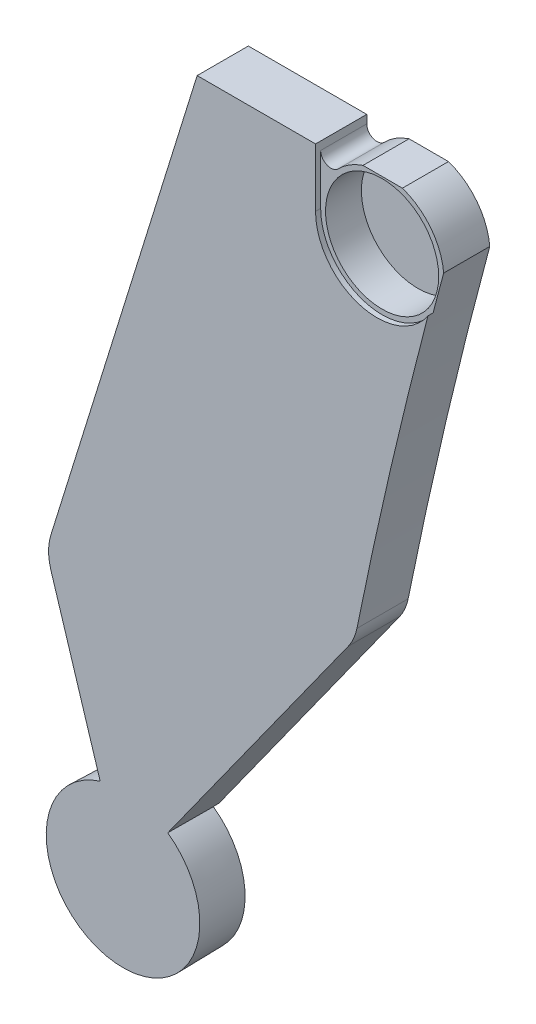
ISO-10303-21;
HEADER;
FILE_DESCRIPTION(('STEP AP214'),'2;1');
FILE_NAME('part.step','',(''),(''),'','','');
FILE_SCHEMA(('AUTOMOTIVE_DESIGN { 1 0 10303 214 1 1 1 1 }'));
ENDSEC;
DATA;
#1=APPLICATION_CONTEXT('core data for automotive mechanical design processes');
#2=APPLICATION_PROTOCOL_DEFINITION('international standard','automotive_design',2000,#1);
#3=PRODUCT_CONTEXT('',#1,'mechanical');
#4=PRODUCT('Part','Part','',(#3));
#5=PRODUCT_RELATED_PRODUCT_CATEGORY('part','',(#4));
#6=PRODUCT_DEFINITION_FORMATION('','',#4);
#7=PRODUCT_DEFINITION_CONTEXT('part definition',#1,'design');
#8=PRODUCT_DEFINITION('design','',#6,#7);
#9=PRODUCT_DEFINITION_SHAPE('','',#8);
#10=(LENGTH_UNIT() NAMED_UNIT(*) SI_UNIT(.MILLI.,.METRE.));
#11=(NAMED_UNIT(*) PLANE_ANGLE_UNIT() SI_UNIT($,.RADIAN.));
#12=(NAMED_UNIT(*) SI_UNIT($,.STERADIAN.) SOLID_ANGLE_UNIT());
#13=UNCERTAINTY_MEASURE_WITH_UNIT(LENGTH_MEASURE(1.E-05),#10,'distance_accuracy_value','');
#14=(GEOMETRIC_REPRESENTATION_CONTEXT(3) GLOBAL_UNCERTAINTY_ASSIGNED_CONTEXT((#13)) GLOBAL_UNIT_ASSIGNED_CONTEXT((#10,
#11,#12)) REPRESENTATION_CONTEXT('',''));
#15=CARTESIAN_POINT('',(0.,0.,0.));
#16=DIRECTION('',(0.,0.,1.));
#17=DIRECTION('',(1.,0.,0.));
#18=AXIS2_PLACEMENT_3D('',#15,#16,#17);
#19=CARTESIAN_POINT('',(110.,290.,10.));
#20=DIRECTION('',(0.,-1.,0.));
#21=DIRECTION('',(0.,0.,-1.));
#22=AXIS2_PLACEMENT_3D('',#19,#20,#21);
#23=PLANE('',#22);
#24=DIRECTION('',(-1.,0.,0.));
#25=VECTOR('',#24,1.);
#26=CARTESIAN_POINT('',(110.,290.,0.));
#27=LINE('',#26,#25);
#28=CARTESIAN_POINT('',(83.1244102791782,290.,0.));
#29=VERTEX_POINT('',#28);
#30=CARTESIAN_POINT('',(60.,290.,0.));
#31=VERTEX_POINT('',#30);
#32=EDGE_CURVE('E158',#29,#31,#27,.T.);
#33=ORIENTED_EDGE('',*,*,#32,.T.);
#34=DIRECTION('',(0.,0.,1.));
#35=VECTOR('',#34,1.);
#36=CARTESIAN_POINT('',(60.,290.,0.));
#37=LINE('',#36,#35);
#38=CARTESIAN_POINT('',(60.,290.,10.));
#39=VERTEX_POINT('',#38);
#40=EDGE_CURVE('E163',#31,#39,#37,.T.);
#41=ORIENTED_EDGE('',*,*,#40,.T.);
#42=DIRECTION('',(-1.,0.,0.));
#43=VECTOR('',#42,1.);
#44=CARTESIAN_POINT('',(110.,290.,10.));
#45=LINE('',#44,#43);
#46=CARTESIAN_POINT('',(83.1244102791782,290.,10.));
#47=VERTEX_POINT('',#46);
#48=EDGE_CURVE('E189',#47,#39,#45,.T.);
#49=ORIENTED_EDGE('',*,*,#48,.F.);
#50=DIRECTION('',(0.,0.,-1.));
#51=VECTOR('',#50,1.);
#52=CARTESIAN_POINT('',(83.1244102791781,290.,10.));
#53=LINE('',#52,#51);
#54=EDGE_CURVE('E174',#47,#29,#53,.T.);
#55=ORIENTED_EDGE('',*,*,#54,.T.);
#56=EDGE_LOOP('',(#33,#41,#49,#55));
#57=FACE_BOUND('',#56,.T.);
#58=ADVANCED_FACE('F36',(#57),#23,.F.);
#59=CARTESIAN_POINT('',(866.,0.,0.));
#60=DIRECTION('',(0.,0.,-1.));
#61=DIRECTION('',(-1.,0.,0.));
#62=AXIS2_PLACEMENT_3D('',#59,#60,#61);
#63=PLANE('',#62);
#64=DIRECTION('',(0.297483501632837,-0.954726959007792,0.));
#65=VECTOR('',#64,1.);
#66=CARTESIAN_POINT('',(25.8476328665139,210.,0.));
#67=LINE('',#66,#65);
#68=CARTESIAN_POINT('',(31.4334430823078,192.073212223037,0.));
#69=VERTEX_POINT('',#68);
#70=CARTESIAN_POINT('',(41.0595930049664,161.179583527098,0.));
#71=VERTEX_POINT('',#70);
#72=EDGE_CURVE('E298',#69,#71,#67,.T.);
#73=ORIENTED_EDGE('',*,*,#72,.F.);
#74=CARTESIAN_POINT('',(40.9807126723857,195.048047239366,0.));
#75=DIRECTION('',(0.,0.,-1.));
#76=DIRECTION('',(-1.,0.,0.));
#77=AXIS2_PLACEMENT_3D('',#74,#75,#76);
#78=CIRCLE('',#77,10.);
#79=CARTESIAN_POINT('',(31.4307163547867,198.014117085786,0.));
#80=VERTEX_POINT('',#79);
#81=EDGE_CURVE('E11',#69,#80,#78,.T.);
#82=ORIENTED_EDGE('',*,*,#81,.T.);
#83=DIRECTION('',(0.296606984642063,0.954999631759899,0.));
#84=VECTOR('',#83,1.);
#85=CARTESIAN_POINT('',(60.,290.,0.));
#86=LINE('',#85,#84);
#87=EDGE_CURVE('E153',#80,#31,#86,.T.);
#88=ORIENTED_EDGE('',*,*,#87,.T.);
#89=ORIENTED_EDGE('',*,*,#32,.F.);
#90=DIRECTION('',(0.,1.,0.));
#91=VECTOR('',#90,1.);
#92=CARTESIAN_POINT('',(83.1244102791782,0.,0.));
#93=LINE('',#92,#91);
#94=CARTESIAN_POINT('',(83.1244102791782,288.394928503876,0.));
#95=VERTEX_POINT('',#94);
#96=EDGE_CURVE('E243',#95,#29,#93,.T.);
#97=ORIENTED_EDGE('',*,*,#96,.F.);
#98=CARTESIAN_POINT('',(85.1244102791781,288.394928503876,0.));
#99=DIRECTION('',(0.,0.,-1.));
#100=DIRECTION('',(-1.,0.,0.));
#101=AXIS2_PLACEMENT_3D('',#98,#99,#100);
#102=CIRCLE('',#101,2.);
#103=CARTESIAN_POINT('',(86.5529817077496,286.995220079428,0.));
#104=VERTEX_POINT('',#103);
#105=EDGE_CURVE('E223',#95,#104,#102,.F.);
#106=ORIENTED_EDGE('',*,*,#105,.T.);
#107=CARTESIAN_POINT('',(95.1244102791782,278.596969532743,0.));
#108=DIRECTION('',(0.,0.,-1.));
#109=DIRECTION('',(-1.,0.,0.));
#110=AXIS2_PLACEMENT_3D('',#107,#108,#109);
#111=CIRCLE('',#110,12.);
#112=CARTESIAN_POINT('',(91.3866440795868,290.,0.));
#113=VERTEX_POINT('',#112);
#114=EDGE_CURVE('E245',#113,#104,#111,.F.);
#115=ORIENTED_EDGE('',*,*,#114,.F.);
#116=CARTESIAN_POINT('',(99.0889064313522,290.,0.));
#117=VERTEX_POINT('',#116);
#118=EDGE_CURVE('E175',#117,#113,#27,.T.);
#119=ORIENTED_EDGE('',*,*,#118,.F.);
#120=CARTESIAN_POINT('',(95.1244102791782,278.596969532743,0.));
#121=DIRECTION('',(0.,0.,-1.));
#122=DIRECTION('',(-1.,0.,0.));
#123=AXIS2_PLACEMENT_3D('',#120,#121,#122);
#124=CIRCLE('',#123,12.072544619002);
#125=CARTESIAN_POINT('',(107.149564915538,279.665608643834,0.));
#126=VERTEX_POINT('',#125);
#127=EDGE_CURVE('E235',#126,#117,#124,.F.);
#128=ORIENTED_EDGE('',*,*,#127,.F.);
#129=CARTESIAN_POINT('',(1141.25,0.,0.));
#130=DIRECTION('',(0.,0.,-1.));
#131=DIRECTION('',(-1.,0.,0.));
#132=AXIS2_PLACEMENT_3D('',#129,#130,#131);
#133=CIRCLE('',#132,1071.25);
#134=CARTESIAN_POINT('',(91.2067735622464,212.098526897742,0.));
#135=VERTEX_POINT('',#134);
#136=EDGE_CURVE('E176',#135,#126,#133,.T.);
#137=ORIENTED_EDGE('',*,*,#136,.F.);
#138=CARTESIAN_POINT('',(81.4047364426407,214.078443134827,0.));
#139=DIRECTION('',(0.,0.,-1.));
#140=DIRECTION('',(-1.,0.,0.));
#141=AXIS2_PLACEMENT_3D('',#138,#139,#140);
#142=CIRCLE('',#141,10.);
#143=CARTESIAN_POINT('',(89.5321794942386,208.252237727958,0.));
#144=VERTEX_POINT('',#143);
#145=EDGE_CURVE('E188',#135,#144,#142,.T.);
#146=ORIENTED_EDGE('',*,*,#145,.T.);
#147=DIRECTION('',(0.582620540686913,0.812744305159802,0.));
#148=VECTOR('',#147,1.);
#149=CARTESIAN_POINT('',(45.521845529459,146.858679141981,0.));
#150=LINE('',#149,#148);
#151=CARTESIAN_POINT('',(54.2611536397626,159.049843719378,0.));
#152=VERTEX_POINT('',#151);
#153=EDGE_CURVE('E181',#152,#144,#150,.T.);
#154=ORIENTED_EDGE('',*,*,#153,.F.);
#155=CARTESIAN_POINT('',(45.521845529459,146.858679141981,0.));
#156=DIRECTION('',(0.,0.,-1.));
#157=DIRECTION('',(-1.,0.,0.));
#158=AXIS2_PLACEMENT_3D('',#155,#156,#157);
#159=CIRCLE('',#158,15.);
#160=EDGE_CURVE('E276',#152,#71,#159,.F.);
#161=ORIENTED_EDGE('',*,*,#160,.T.);
#162=EDGE_LOOP('',(#73,#82,#88,#89,#97,#106,#115,#119,#128,#137,#146,#154,#161));
#163=FACE_BOUND('',#162,.T.);
#164=ADVANCED_FACE('F155',(#163),#63,.T.);
#165=CARTESIAN_POINT('',(95.1244102791782,278.596969532743,9.));
#166=DIRECTION('',(0.,0.,1.));
#167=DIRECTION('',(1.,0.,0.));
#168=AXIS2_PLACEMENT_3D('',#165,#166,#167);
#169=PLANE('',#168);
#170=CARTESIAN_POINT('',(95.1244102791782,278.596969532743,9.));
#171=DIRECTION('',(0.,0.,1.));
#172=DIRECTION('',(1.,0.,0.));
#173=AXIS2_PLACEMENT_3D('',#170,#171,#172);
#174=CIRCLE('',#173,11.05);
#175=CARTESIAN_POINT('',(106.174410279178,278.596969532743,9.));
#176=VERTEX_POINT('',#175);
#177=EDGE_CURVE('E248',#176,#176,#174,.T.);
#178=ORIENTED_EDGE('',*,*,#177,.F.);
#179=EDGE_LOOP('',(#178));
#180=FACE_BOUND('',#179,.T.);
#181=CARTESIAN_POINT('',(95.1244102791782,278.596969532743,9.));
#182=DIRECTION('',(0.,0.,-1.));
#183=DIRECTION('',(-1.,0.,0.));
#184=AXIS2_PLACEMENT_3D('',#181,#182,#183);
#185=CIRCLE('',#184,12.);
#186=CARTESIAN_POINT('',(86.5529817077496,286.995220079428,9.));
#187=VERTEX_POINT('',#186);
#188=CARTESIAN_POINT('',(91.3866440795868,290.,9.));
#189=VERTEX_POINT('',#188);
#190=EDGE_CURVE('E171',#187,#189,#185,.T.);
#191=ORIENTED_EDGE('',*,*,#190,.F.);
#192=CARTESIAN_POINT('',(85.1244102791781,288.394928503876,9.));
#193=DIRECTION('',(0.,0.,1.));
#194=DIRECTION('',(1.,0.,0.));
#195=AXIS2_PLACEMENT_3D('',#192,#193,#194);
#196=CIRCLE('',#195,2.);
#197=CARTESIAN_POINT('',(83.1244102791781,288.394928503876,9.));
#198=VERTEX_POINT('',#197);
#199=EDGE_CURVE('E221',#187,#198,#196,.F.);
#200=ORIENTED_EDGE('',*,*,#199,.T.);
#201=DIRECTION('',(0.,1.,0.));
#202=VECTOR('',#201,1.);
#203=CARTESIAN_POINT('',(83.1244102791781,278.596969532743,9.));
#204=LINE('',#203,#202);
#205=CARTESIAN_POINT('',(83.1244102791781,278.596969532743,9.));
#206=VERTEX_POINT('',#205);
#207=EDGE_CURVE('E218',#206,#198,#204,.T.);
#208=ORIENTED_EDGE('',*,*,#207,.F.);
#209=CARTESIAN_POINT('',(95.1244102791782,278.596969532743,9.));
#210=DIRECTION('',(0.,0.,1.));
#211=DIRECTION('',(1.,0.,0.));
#212=AXIS2_PLACEMENT_3D('',#209,#210,#211);
#213=CIRCLE('',#212,12.);
#214=CARTESIAN_POINT('',(105.079858658712,271.89704061055,9.));
#215=VERTEX_POINT('',#214);
#216=EDGE_CURVE('E255',#206,#215,#213,.T.);
#217=ORIENTED_EDGE('',*,*,#216,.T.);
#218=CARTESIAN_POINT('',(1141.25,0.,9.));
#219=DIRECTION('',(0.,0.,1.));
#220=DIRECTION('',(1.,0.,0.));
#221=AXIS2_PLACEMENT_3D('',#218,#219,#220);
#222=CIRCLE('',#221,1071.25);
#223=CARTESIAN_POINT('',(107.149564915525,279.665608643833,9.));
#224=VERTEX_POINT('',#223);
#225=EDGE_CURVE('E266',#215,#224,#222,.F.);
#226=ORIENTED_EDGE('',*,*,#225,.T.);
#227=CARTESIAN_POINT('',(95.1244102791782,278.596969532743,9.));
#228=DIRECTION('',(0.,0.,1.));
#229=DIRECTION('',(1.,0.,0.));
#230=AXIS2_PLACEMENT_3D('',#227,#228,#229);
#231=CIRCLE('',#230,12.072544619002);
#232=CARTESIAN_POINT('',(99.0889064313522,290.,9.));
#233=VERTEX_POINT('',#232);
#234=EDGE_CURVE('E211',#233,#224,#231,.F.);
#235=ORIENTED_EDGE('',*,*,#234,.F.);
#236=DIRECTION('',(-1.,0.,0.));
#237=VECTOR('',#236,1.);
#238=CARTESIAN_POINT('',(110.,290.,9.));
#239=LINE('',#238,#237);
#240=EDGE_CURVE('E208',#233,#189,#239,.T.);
#241=ORIENTED_EDGE('',*,*,#240,.T.);
#242=EDGE_LOOP('',(#191,#200,#208,#217,#226,#235,#241));
#243=FACE_BOUND('',#242,.T.);
#244=ADVANCED_FACE('F321',(#180,#243),#169,.T.);
#245=CARTESIAN_POINT('',(25.8476328665139,210.,-90.5742654006177));
#246=DIRECTION('',(-0.954726959007792,-0.297483501632837,0.));
#247=DIRECTION('',(0.297483501632837,-0.954726959007792,0.));
#248=AXIS2_PLACEMENT_3D('',#245,#246,#247);
#249=PLANE('',#248);
#250=DIRECTION('',(0.297483501632837,-0.954726959007792,0.));
#251=VECTOR('',#250,1.);
#252=CARTESIAN_POINT('',(25.8476328665139,210.,10.));
#253=LINE('',#252,#251);
#254=CARTESIAN_POINT('',(31.4334430823078,192.073212223037,10.));
#255=VERTEX_POINT('',#254);
#256=CARTESIAN_POINT('',(41.0595930049664,161.179583527098,10.));
#257=VERTEX_POINT('',#256);
#258=EDGE_CURVE('E294',#255,#257,#253,.T.);
#259=ORIENTED_EDGE('',*,*,#258,.F.);
#260=DIRECTION('',(0.,0.,1.));
#261=VECTOR('',#260,1.);
#262=CARTESIAN_POINT('',(31.4334430823078,192.073212223037,0.));
#263=LINE('',#262,#261);
#264=EDGE_CURVE('E44',#255,#69,#263,.F.);
#265=ORIENTED_EDGE('',*,*,#264,.T.);
#266=ORIENTED_EDGE('',*,*,#72,.T.);
#267=DIRECTION('',(0.,0.,1.));
#268=VECTOR('',#267,1.);
#269=CARTESIAN_POINT('',(41.0595930049664,161.179583527098,-0.999999999999999));
#270=LINE('',#269,#268);
#271=CARTESIAN_POINT('',(41.0595930049664,161.179583527098,1.));
#272=VERTEX_POINT('',#271);
#273=EDGE_CURVE('E280',#71,#272,#270,.T.);
#274=ORIENTED_EDGE('',*,*,#273,.T.);
#275=DIRECTION('',(0.297483501632837,-0.954726959007792,0.));
#276=VECTOR('',#275,1.);
#277=CARTESIAN_POINT('',(25.8476328665139,210.,1.));
#278=LINE('',#277,#276);
#279=CARTESIAN_POINT('',(41.1063263494911,161.029600137574,1.));
#280=VERTEX_POINT('',#279);
#281=EDGE_CURVE('E272',#272,#280,#278,.T.);
#282=ORIENTED_EDGE('',*,*,#281,.T.);
#283=DIRECTION('',(0.00519180297888258,-0.0166622829252357,-0.999847695156391));
#284=VECTOR('',#283,1.);
#285=CARTESIAN_POINT('',(45.521845529459,146.858679141981,-849.34942446139));
#286=LINE('',#285,#284);
#287=EDGE_CURVE('E291',#257,#280,#286,.T.);
#288=ORIENTED_EDGE('',*,*,#287,.F.);
#289=EDGE_LOOP('',(#259,#265,#266,#274,#282,#288));
#290=FACE_BOUND('',#289,.T.);
#291=ADVANCED_FACE('F393',(#290),#249,.T.);
#292=CARTESIAN_POINT('',(45.521845529459,146.858679141981,-90.5742654006177));
#293=DIRECTION('',(0.812744305159802,-0.582620540686913,0.));
#294=DIRECTION('',(0.582620540686913,0.812744305159802,0.));
#295=AXIS2_PLACEMENT_3D('',#292,#293,#294);
#296=PLANE('',#295);
#297=DIRECTION('',(0.582620540686913,0.812744305159802,0.));
#298=VECTOR('',#297,1.);
#299=CARTESIAN_POINT('',(45.521845529459,146.858679141981,1.));
#300=LINE('',#299,#298);
#301=CARTESIAN_POINT('',(54.1696265254668,158.922165177828,1.));
#302=VERTEX_POINT('',#301);
#303=CARTESIAN_POINT('',(54.2611536397626,159.049843719378,1.));
#304=VERTEX_POINT('',#303);
#305=EDGE_CURVE('E273',#302,#304,#300,.T.);
#306=ORIENTED_EDGE('',*,*,#305,.T.);
#307=DIRECTION('',(0.,0.,1.));
#308=VECTOR('',#307,1.);
#309=CARTESIAN_POINT('',(54.2611536397626,159.049843719378,-0.999999999999999));
#310=LINE('',#309,#308);
#311=EDGE_CURVE('E202',#304,#152,#310,.F.);
#312=ORIENTED_EDGE('',*,*,#311,.T.);
#313=ORIENTED_EDGE('',*,*,#153,.T.);
#314=DIRECTION('',(0.,0.,1.));
#315=VECTOR('',#314,1.);
#316=CARTESIAN_POINT('',(89.5321794942386,208.252237727958,10.));
#317=LINE('',#316,#315);
#318=CARTESIAN_POINT('',(89.5321794942386,208.252237727958,10.));
#319=VERTEX_POINT('',#318);
#320=EDGE_CURVE('E194',#144,#319,#317,.T.);
#321=ORIENTED_EDGE('',*,*,#320,.T.);
#322=DIRECTION('',(0.582620540686913,0.812744305159802,0.));
#323=VECTOR('',#322,1.);
#324=CARTESIAN_POINT('',(45.521845529459,146.858679141981,10.));
#325=LINE('',#324,#323);
#326=CARTESIAN_POINT('',(54.2611536397626,159.049843719378,10.));
#327=VERTEX_POINT('',#326);
#328=EDGE_CURVE('E295',#327,#319,#325,.T.);
#329=ORIENTED_EDGE('',*,*,#328,.F.);
#330=DIRECTION('',(0.0101681304747779,0.0141843439432365,0.999847695156391));
#331=VECTOR('',#330,1.);
#332=CARTESIAN_POINT('',(45.521845529459,146.858679141981,-849.34942446139));
#333=LINE('',#332,#331);
#334=EDGE_CURVE('E185',#302,#327,#333,.T.);
#335=ORIENTED_EDGE('',*,*,#334,.F.);
#336=EDGE_LOOP('',(#306,#312,#313,#321,#329,#335));
#337=FACE_BOUND('',#336,.T.);
#338=ADVANCED_FACE('F367',(#337),#296,.T.);
#339=CARTESIAN_POINT('',(45.521845529459,146.858679141981,8.));
#340=DIRECTION('',(0.,0.,-1.));
#341=DIRECTION('',(-1.,0.,0.));
#342=AXIS2_PLACEMENT_3D('',#339,#340,#341);
#343=CYLINDRICAL_SURFACE('',#342,11.5);
#344=CARTESIAN_POINT('',(45.521845529459,146.858679141981,8.));
#345=DIRECTION('',(0.,0.,-1.));
#346=DIRECTION('',(-1.,0.,0.));
#347=AXIS2_PLACEMENT_3D('',#344,#345,#346);
#348=CIRCLE('',#347,11.5);
#349=CARTESIAN_POINT('',(34.0218455294589,146.858679141981,8.));
#350=VERTEX_POINT('',#349);
#351=EDGE_CURVE('E283',#350,#350,#348,.T.);
#352=ORIENTED_EDGE('',*,*,#351,.F.);
#353=EDGE_LOOP('',(#352));
#354=FACE_BOUND('',#353,.T.);
#355=CARTESIAN_POINT('',(45.521845529459,146.858679141981,1.));
#356=DIRECTION('',(0.,0.,1.));
#357=DIRECTION('',(1.,0.,0.));
#358=AXIS2_PLACEMENT_3D('',#355,#356,#357);
#359=CIRCLE('',#358,11.5);
#360=CARTESIAN_POINT('',(57.021845529459,146.858679141981,1.));
#361=VERTEX_POINT('',#360);
#362=EDGE_CURVE('E199',#361,#361,#359,.T.);
#363=ORIENTED_EDGE('',*,*,#362,.F.);
#364=EDGE_LOOP('',(#363));
#365=FACE_BOUND('',#364,.T.);
#366=ADVANCED_FACE('F363',(#354,#365),#343,.F.);
#367=CARTESIAN_POINT('',(1141.25,0.,10.));
#368=DIRECTION('',(0.,0.,-1.));
#369=DIRECTION('',(-1.,0.,0.));
#370=AXIS2_PLACEMENT_3D('',#367,#368,#369);
#371=CYLINDRICAL_SURFACE('',#370,1071.25);
#372=ORIENTED_EDGE('',*,*,#136,.T.);
#373=DIRECTION('',(0.,0.,1.));
#374=VECTOR('',#373,1.);
#375=CARTESIAN_POINT('',(107.149564915525,279.665608643833,4.5));
#376=LINE('',#375,#374);
#377=EDGE_CURVE('E240',#126,#224,#376,.T.);
#378=ORIENTED_EDGE('',*,*,#377,.T.);
#379=ORIENTED_EDGE('',*,*,#225,.F.);
#380=DIRECTION('',(0.,0.,1.));
#381=VECTOR('',#380,1.);
#382=CARTESIAN_POINT('',(105.079858658699,271.897040610531,9.5));
#383=LINE('',#382,#381);
#384=CARTESIAN_POINT('',(105.079858658699,271.897040610531,10.));
#385=VERTEX_POINT('',#384);
#386=EDGE_CURVE('E263',#215,#385,#383,.T.);
#387=ORIENTED_EDGE('',*,*,#386,.T.);
#388=CARTESIAN_POINT('',(1141.25,0.,10.));
#389=DIRECTION('',(0.,0.,-1.));
#390=DIRECTION('',(-1.,0.,0.));
#391=AXIS2_PLACEMENT_3D('',#388,#389,#390);
#392=CIRCLE('',#391,1071.25);
#393=CARTESIAN_POINT('',(91.2067735622464,212.098526897742,10.));
#394=VERTEX_POINT('',#393);
#395=EDGE_CURVE('E179',#394,#385,#392,.T.);
#396=ORIENTED_EDGE('',*,*,#395,.F.);
#397=DIRECTION('',(0.,0.,-1.));
#398=VECTOR('',#397,1.);
#399=CARTESIAN_POINT('',(91.2067735622462,212.098526897742,10.));
#400=LINE('',#399,#398);
#401=EDGE_CURVE('E197',#394,#135,#400,.T.);
#402=ORIENTED_EDGE('',*,*,#401,.T.);
#403=EDGE_LOOP('',(#372,#378,#379,#387,#396,#402));
#404=FACE_BOUND('',#403,.T.);
#405=ADVANCED_FACE('F307',(#404),#371,.F.);
#406=ORIENTED_EDGE('',*,*,#118,.T.);
#407=DIRECTION('',(0.,0.,1.));
#408=VECTOR('',#407,1.);
#409=CARTESIAN_POINT('',(91.3866440795868,290.,-0.999999999999999));
#410=LINE('',#409,#408);
#411=EDGE_CURVE('E232',#113,#189,#410,.T.);
#412=ORIENTED_EDGE('',*,*,#411,.T.);
#413=ORIENTED_EDGE('',*,*,#240,.F.);
#414=DIRECTION('',(0.,0.,1.));
#415=VECTOR('',#414,1.);
#416=CARTESIAN_POINT('',(99.0889064313522,290.,-0.999999999999999));
#417=LINE('',#416,#415);
#418=EDGE_CURVE('E237',#233,#117,#417,.F.);
#419=ORIENTED_EDGE('',*,*,#418,.T.);
#420=EDGE_LOOP('',(#406,#412,#413,#419));
#421=FACE_BOUND('',#420,.T.);
#422=ADVANCED_FACE('F338',(#421),#23,.F.);
#423=CARTESIAN_POINT('',(866.,0.,10.));
#424=DIRECTION('',(0.,0.,-1.));
#425=DIRECTION('',(-1.,0.,0.));
#426=AXIS2_PLACEMENT_3D('',#423,#424,#425);
#427=PLANE('',#426);
#428=DIRECTION('',(0.296606984642063,0.954999631759899,0.));
#429=VECTOR('',#428,1.);
#430=CARTESIAN_POINT('',(60.,290.,10.));
#431=LINE('',#430,#429);
#432=CARTESIAN_POINT('',(31.4307163547867,198.014117085786,10.));
#433=VERTEX_POINT('',#432);
#434=EDGE_CURVE('E164',#433,#39,#431,.T.);
#435=ORIENTED_EDGE('',*,*,#434,.F.);
#436=CARTESIAN_POINT('',(40.9807126723857,195.048047239366,10.));
#437=DIRECTION('',(0.,0.,-1.));
#438=DIRECTION('',(-1.,0.,0.));
#439=AXIS2_PLACEMENT_3D('',#436,#437,#438);
#440=CIRCLE('',#439,10.);
#441=EDGE_CURVE('E58',#433,#255,#440,.F.);
#442=ORIENTED_EDGE('',*,*,#441,.T.);
#443=ORIENTED_EDGE('',*,*,#258,.T.);
#444=CARTESIAN_POINT('',(45.521845529459,146.858679141981,10.));
#445=DIRECTION('',(0.,0.,1.));
#446=DIRECTION('',(1.,0.,0.));
#447=AXIS2_PLACEMENT_3D('',#444,#445,#446);
#448=CIRCLE('',#447,15.);
#449=EDGE_CURVE('E286',#257,#327,#448,.T.);
#450=ORIENTED_EDGE('',*,*,#449,.T.);
#451=ORIENTED_EDGE('',*,*,#328,.T.);
#452=CARTESIAN_POINT('',(81.4047364426407,214.078443134827,10.));
#453=DIRECTION('',(0.,0.,-1.));
#454=DIRECTION('',(-1.,0.,0.));
#455=AXIS2_PLACEMENT_3D('',#452,#453,#454);
#456=CIRCLE('',#455,10.);
#457=EDGE_CURVE('E192',#319,#394,#456,.F.);
#458=ORIENTED_EDGE('',*,*,#457,.T.);
#459=ORIENTED_EDGE('',*,*,#395,.T.);
#460=CARTESIAN_POINT('',(95.1244102791782,278.596969532743,10.));
#461=DIRECTION('',(0.,0.,1.));
#462=DIRECTION('',(1.,0.,0.));
#463=AXIS2_PLACEMENT_3D('',#460,#461,#462);
#464=CIRCLE('',#463,12.);
#465=CARTESIAN_POINT('',(83.1244102791781,278.596969532743,10.));
#466=VERTEX_POINT('',#465);
#467=EDGE_CURVE('E252',#466,#385,#464,.T.);
#468=ORIENTED_EDGE('',*,*,#467,.F.);
#469=DIRECTION('',(0.,1.,0.));
#470=VECTOR('',#469,1.);
#471=CARTESIAN_POINT('',(83.1244102791782,0.,10.));
#472=LINE('',#471,#470);
#473=EDGE_CURVE('E205',#466,#47,#472,.T.);
#474=ORIENTED_EDGE('',*,*,#473,.T.);
#475=ORIENTED_EDGE('',*,*,#48,.T.);
#476=EDGE_LOOP('',(#435,#442,#443,#450,#451,#458,#459,#468,#474,#475));
#477=FACE_BOUND('',#476,.T.);
#478=ADVANCED_FACE('F228',(#477),#427,.F.);
#479=CARTESIAN_POINT('',(45.521845529459,146.858679141981,10.));
#480=DIRECTION('',(0.,0.,1.));
#481=DIRECTION('',(1.,0.,0.));
#482=AXIS2_PLACEMENT_3D('',#479,#480,#481);
#483=CONICAL_SURFACE('',#482,15.,0.0174532925199433);
#484=ORIENTED_EDGE('',*,*,#449,.F.);
#485=ORIENTED_EDGE('',*,*,#287,.T.);
#486=CARTESIAN_POINT('',(45.521845529459,146.858679141981,1.));
#487=DIRECTION('',(0.,0.,1.));
#488=DIRECTION('',(1.,0.,0.));
#489=AXIS2_PLACEMENT_3D('',#486,#487,#488);
#490=CIRCLE('',#489,14.842904415646);
#491=EDGE_CURVE('E288',#280,#302,#490,.T.);
#492=ORIENTED_EDGE('',*,*,#491,.T.);
#493=ORIENTED_EDGE('',*,*,#334,.T.);
#494=EDGE_LOOP('',(#484,#485,#492,#493));
#495=FACE_BOUND('',#494,.T.);
#496=ADVANCED_FACE('F361',(#495),#483,.T.);
#497=CARTESIAN_POINT('',(45.521845529459,146.858679141981,1.));
#498=DIRECTION('',(0.,0.,1.));
#499=DIRECTION('',(1.,0.,0.));
#500=AXIS2_PLACEMENT_3D('',#497,#498,#499);
#501=PLANE('',#500);
#502=ORIENTED_EDGE('',*,*,#491,.F.);
#503=ORIENTED_EDGE('',*,*,#281,.F.);
#504=CARTESIAN_POINT('',(45.521845529459,146.858679141981,1.));
#505=DIRECTION('',(0.,0.,-1.));
#506=DIRECTION('',(-1.,0.,0.));
#507=AXIS2_PLACEMENT_3D('',#504,#505,#506);
#508=CIRCLE('',#507,15.);
#509=EDGE_CURVE('E269',#272,#304,#508,.T.);
#510=ORIENTED_EDGE('',*,*,#509,.T.);
#511=ORIENTED_EDGE('',*,*,#305,.F.);
#512=EDGE_LOOP('',(#502,#503,#510,#511));
#513=FACE_BOUND('',#512,.T.);
#514=ORIENTED_EDGE('',*,*,#362,.T.);
#515=EDGE_LOOP('',(#514));
#516=FACE_BOUND('',#515,.T.);
#517=ADVANCED_FACE('F373',(#513,#516),#501,.F.);
#518=CARTESIAN_POINT('',(81.4047364426407,214.078443134827,10.));
#519=DIRECTION('',(0.,0.,-1.));
#520=DIRECTION('',(-1.,0.,0.));
#521=AXIS2_PLACEMENT_3D('',#518,#519,#520);
#522=CYLINDRICAL_SURFACE('',#521,10.);
#523=ORIENTED_EDGE('',*,*,#145,.F.);
#524=ORIENTED_EDGE('',*,*,#401,.F.);
#525=ORIENTED_EDGE('',*,*,#457,.F.);
#526=ORIENTED_EDGE('',*,*,#320,.F.);
#527=EDGE_LOOP('',(#523,#524,#525,#526));
#528=FACE_BOUND('',#527,.T.);
#529=ADVANCED_FACE('F312',(#528),#522,.T.);
#530=CARTESIAN_POINT('',(45.521845529459,146.858679141981,8.));
#531=DIRECTION('',(0.,0.,-1.));
#532=DIRECTION('',(-1.,0.,0.));
#533=AXIS2_PLACEMENT_3D('',#530,#531,#532);
#534=PLANE('',#533);
#535=ORIENTED_EDGE('',*,*,#351,.T.);
#536=EDGE_LOOP('',(#535));
#537=FACE_BOUND('',#536,.T.);
#538=ADVANCED_FACE('F372',(#537),#534,.T.);
#539=CARTESIAN_POINT('',(45.521845529459,146.858679141981,-0.999999999999999));
#540=DIRECTION('',(0.,0.,1.));
#541=DIRECTION('',(1.,0.,0.));
#542=AXIS2_PLACEMENT_3D('',#539,#540,#541);
#543=CYLINDRICAL_SURFACE('',#542,15.);
#544=ORIENTED_EDGE('',*,*,#160,.F.);
#545=ORIENTED_EDGE('',*,*,#311,.F.);
#546=ORIENTED_EDGE('',*,*,#509,.F.);
#547=ORIENTED_EDGE('',*,*,#273,.F.);
#548=EDGE_LOOP('',(#544,#545,#546,#547));
#549=FACE_BOUND('',#548,.T.);
#550=ADVANCED_FACE('F378',(#549),#543,.F.);
#551=CARTESIAN_POINT('',(95.1244102791782,278.596969532743,9.));
#552=DIRECTION('',(0.,0.,1.));
#553=DIRECTION('',(1.,0.,0.));
#554=AXIS2_PLACEMENT_3D('',#551,#552,#553);
#555=CYLINDRICAL_SURFACE('',#554,12.);
#556=ORIENTED_EDGE('',*,*,#216,.F.);
#557=DIRECTION('',(0.,0.,1.));
#558=VECTOR('',#557,1.);
#559=CARTESIAN_POINT('',(83.1244102791781,278.596969532743,9.));
#560=LINE('',#559,#558);
#561=EDGE_CURVE('E258',#206,#466,#560,.T.);
#562=ORIENTED_EDGE('',*,*,#561,.T.);
#563=ORIENTED_EDGE('',*,*,#467,.T.);
#564=ORIENTED_EDGE('',*,*,#386,.F.);
#565=EDGE_LOOP('',(#556,#562,#563,#564));
#566=FACE_BOUND('',#565,.T.);
#567=ADVANCED_FACE('F326',(#566),#555,.F.);
#568=CARTESIAN_POINT('',(83.1244102791781,278.596969532743,9.));
#569=DIRECTION('',(-1.,0.,0.));
#570=DIRECTION('',(0.,0.,1.));
#571=AXIS2_PLACEMENT_3D('',#568,#569,#570);
#572=PLANE('',#571);
#573=ORIENTED_EDGE('',*,*,#561,.F.);
#574=ORIENTED_EDGE('',*,*,#207,.T.);
#575=DIRECTION('',(0.,0.,-1.));
#576=VECTOR('',#575,1.);
#577=CARTESIAN_POINT('',(83.1244102791781,288.394928503876,0.));
#578=LINE('',#577,#576);
#579=EDGE_CURVE('E216',#198,#95,#578,.T.);
#580=ORIENTED_EDGE('',*,*,#579,.T.);
#581=ORIENTED_EDGE('',*,*,#96,.T.);
#582=ORIENTED_EDGE('',*,*,#54,.F.);
#583=ORIENTED_EDGE('',*,*,#473,.F.);
#584=EDGE_LOOP('',(#573,#574,#580,#581,#582,#583));
#585=FACE_BOUND('',#584,.T.);
#586=ADVANCED_FACE('F328',(#585),#572,.F.);
#587=CARTESIAN_POINT('',(95.1244102791782,278.596969532743,2.));
#588=DIRECTION('',(0.,0.,1.));
#589=DIRECTION('',(1.,0.,0.));
#590=AXIS2_PLACEMENT_3D('',#587,#588,#589);
#591=CYLINDRICAL_SURFACE('',#590,11.05);
#592=CARTESIAN_POINT('',(95.1244102791782,278.596969532743,2.));
#593=DIRECTION('',(0.,0.,1.));
#594=DIRECTION('',(1.,0.,0.));
#595=AXIS2_PLACEMENT_3D('',#592,#593,#594);
#596=CIRCLE('',#595,11.05);
#597=CARTESIAN_POINT('',(106.174410279178,278.596969532743,2.));
#598=VERTEX_POINT('',#597);
#599=EDGE_CURVE('E249',#598,#598,#596,.T.);
#600=ORIENTED_EDGE('',*,*,#599,.F.);
#601=EDGE_LOOP('',(#600));
#602=FACE_BOUND('',#601,.T.);
#603=ORIENTED_EDGE('',*,*,#177,.T.);
#604=EDGE_LOOP('',(#603));
#605=FACE_BOUND('',#604,.T.);
#606=ADVANCED_FACE('F474',(#602,#605),#591,.F.);
#607=CARTESIAN_POINT('',(95.1244102791782,278.596969532743,2.));
#608=DIRECTION('',(0.,0.,1.));
#609=DIRECTION('',(1.,0.,0.));
#610=AXIS2_PLACEMENT_3D('',#607,#608,#609);
#611=PLANE('',#610);
#612=ORIENTED_EDGE('',*,*,#599,.T.);
#613=EDGE_LOOP('',(#612));
#614=FACE_BOUND('',#613,.T.);
#615=ADVANCED_FACE('F346',(#614),#611,.T.);
#616=CARTESIAN_POINT('',(95.1244102791782,278.596969532743,-0.999999999999999));
#617=DIRECTION('',(0.,0.,1.));
#618=DIRECTION('',(1.,0.,0.));
#619=AXIS2_PLACEMENT_3D('',#616,#617,#618);
#620=CYLINDRICAL_SURFACE('',#619,12.);
#621=ORIENTED_EDGE('',*,*,#114,.T.);
#622=DIRECTION('',(0.,0.,1.));
#623=VECTOR('',#622,1.);
#624=CARTESIAN_POINT('',(86.5529817077496,286.995220079428,-0.999999999999999));
#625=LINE('',#624,#623);
#626=EDGE_CURVE('E213',#104,#187,#625,.T.);
#627=ORIENTED_EDGE('',*,*,#626,.T.);
#628=ORIENTED_EDGE('',*,*,#190,.T.);
#629=ORIENTED_EDGE('',*,*,#411,.F.);
#630=EDGE_LOOP('',(#621,#627,#628,#629));
#631=FACE_BOUND('',#630,.T.);
#632=ADVANCED_FACE('F336',(#631),#620,.T.);
#633=CARTESIAN_POINT('',(95.1244102791782,278.596969532743,-0.999999999999999));
#634=DIRECTION('',(0.,0.,1.));
#635=DIRECTION('',(1.,0.,0.));
#636=AXIS2_PLACEMENT_3D('',#633,#634,#635);
#637=CYLINDRICAL_SURFACE('',#636,12.072544619002);
#638=ORIENTED_EDGE('',*,*,#127,.T.);
#639=ORIENTED_EDGE('',*,*,#418,.F.);
#640=ORIENTED_EDGE('',*,*,#234,.T.);
#641=ORIENTED_EDGE('',*,*,#377,.F.);
#642=EDGE_LOOP('',(#638,#639,#640,#641));
#643=FACE_BOUND('',#642,.T.);
#644=ADVANCED_FACE('F339',(#643),#637,.T.);
#645=CARTESIAN_POINT('',(85.1244102791781,288.394928503876,-0.999999999999999));
#646=DIRECTION('',(0.,0.,1.));
#647=DIRECTION('',(1.,0.,0.));
#648=AXIS2_PLACEMENT_3D('',#645,#646,#647);
#649=CYLINDRICAL_SURFACE('',#648,2.);
#650=ORIENTED_EDGE('',*,*,#105,.F.);
#651=ORIENTED_EDGE('',*,*,#579,.F.);
#652=ORIENTED_EDGE('',*,*,#199,.F.);
#653=ORIENTED_EDGE('',*,*,#626,.F.);
#654=EDGE_LOOP('',(#650,#651,#652,#653));
#655=FACE_BOUND('',#654,.T.);
#656=ADVANCED_FACE('F334',(#655),#649,.F.);
#657=CARTESIAN_POINT('',(60.,290.,0.));
#658=DIRECTION('',(0.954999631759899,-0.296606984642063,0.));
#659=DIRECTION('',(0.296606984642063,0.954999631759899,0.));
#660=AXIS2_PLACEMENT_3D('',#657,#658,#659);
#661=PLANE('',#660);
#662=ORIENTED_EDGE('',*,*,#87,.F.);
#663=DIRECTION('',(0.,0.,1.));
#664=VECTOR('',#663,1.);
#665=CARTESIAN_POINT('',(31.4307163547868,198.014117085786,10.));
#666=LINE('',#665,#664);
#667=EDGE_CURVE('E225',#80,#433,#666,.T.);
#668=ORIENTED_EDGE('',*,*,#667,.T.);
#669=ORIENTED_EDGE('',*,*,#434,.T.);
#670=ORIENTED_EDGE('',*,*,#40,.F.);
#671=EDGE_LOOP('',(#662,#668,#669,#670));
#672=FACE_BOUND('',#671,.T.);
#673=ADVANCED_FACE('F167',(#672),#661,.F.);
#674=CARTESIAN_POINT('',(40.9807126723857,195.048047239366,0.));
#675=DIRECTION('',(0.,0.,-1.));
#676=DIRECTION('',(-1.,0.,0.));
#677=AXIS2_PLACEMENT_3D('',#674,#675,#676);
#678=CYLINDRICAL_SURFACE('',#677,10.);
#679=ORIENTED_EDGE('',*,*,#81,.F.);
#680=ORIENTED_EDGE('',*,*,#264,.F.);
#681=ORIENTED_EDGE('',*,*,#441,.F.);
#682=ORIENTED_EDGE('',*,*,#667,.F.);
#683=EDGE_LOOP('',(#679,#680,#681,#682));
#684=FACE_BOUND('',#683,.T.);
#685=ADVANCED_FACE('F38',(#684),#678,.T.);
#686=CLOSED_SHELL('',(#58,#164,#244,#291,#338,#366,#405,#422,#478,#496,#517,#529,#538,#550,#567,
#586,#606,#615,#632,#644,#656,#673,#685));
#687=MANIFOLD_SOLID_BREP('B2',#686);
#688=ADVANCED_BREP_SHAPE_REPRESENTATION('',(#18,#687),#14);
#689=SHAPE_DEFINITION_REPRESENTATION(#9,#688);
ENDSEC;
END-ISO-10303-21;
